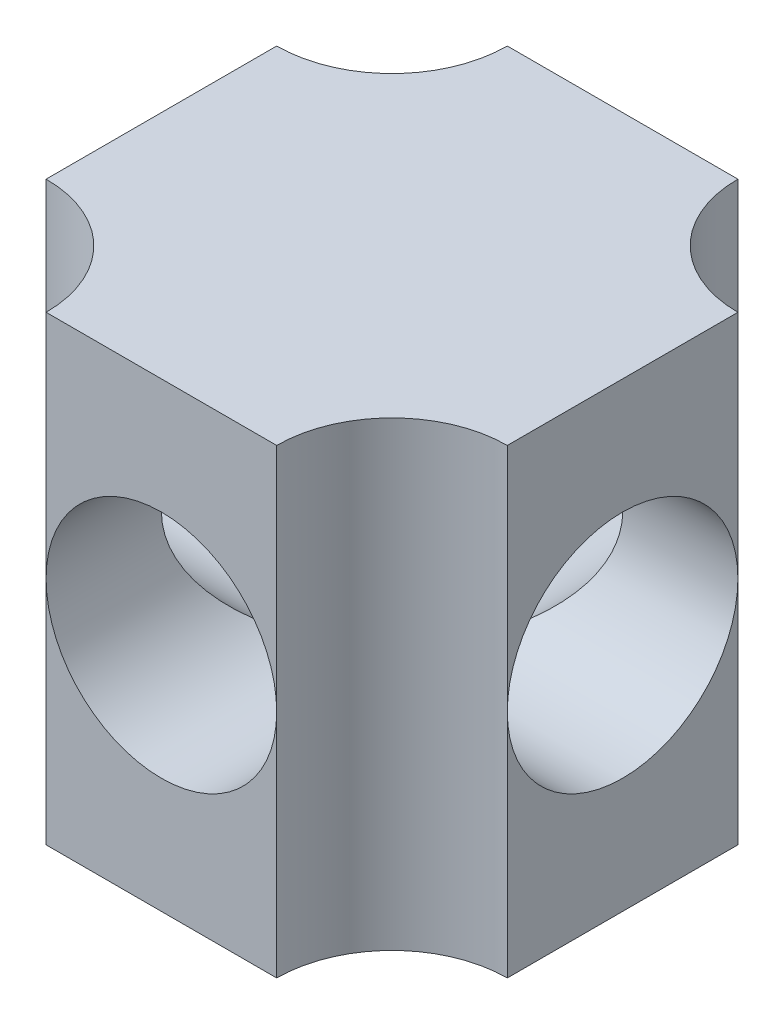
ISO-10303-21;
HEADER;
FILE_DESCRIPTION(('STEP AP214'),'2;1');
FILE_NAME('part.step','',(''),(''),'','','');
FILE_SCHEMA(('AUTOMOTIVE_DESIGN { 1 0 10303 214 1 1 1 1 }'));
ENDSEC;
DATA;
#1=APPLICATION_CONTEXT('core data for automotive mechanical design processes');
#2=APPLICATION_PROTOCOL_DEFINITION('international standard','automotive_design',2000,#1);
#3=PRODUCT_CONTEXT('',#1,'mechanical');
#4=PRODUCT('Part','Part','',(#3));
#5=PRODUCT_RELATED_PRODUCT_CATEGORY('part','',(#4));
#6=PRODUCT_DEFINITION_FORMATION('','',#4);
#7=PRODUCT_DEFINITION_CONTEXT('part definition',#1,'design');
#8=PRODUCT_DEFINITION('design','',#6,#7);
#9=PRODUCT_DEFINITION_SHAPE('','',#8);
#10=(LENGTH_UNIT() NAMED_UNIT(*) SI_UNIT(.MILLI.,.METRE.));
#11=(NAMED_UNIT(*) PLANE_ANGLE_UNIT() SI_UNIT($,.RADIAN.));
#12=(NAMED_UNIT(*) SI_UNIT($,.STERADIAN.) SOLID_ANGLE_UNIT());
#13=UNCERTAINTY_MEASURE_WITH_UNIT(LENGTH_MEASURE(1.E-05),#10,'distance_accuracy_value','');
#14=(GEOMETRIC_REPRESENTATION_CONTEXT(3) GLOBAL_UNCERTAINTY_ASSIGNED_CONTEXT((#13)) GLOBAL_UNIT_ASSIGNED_CONTEXT((#10,
#11,#12)) REPRESENTATION_CONTEXT('',''));
#15=CARTESIAN_POINT('',(0.,0.,0.));
#16=DIRECTION('',(0.,0.,1.));
#17=DIRECTION('',(1.,0.,0.));
#18=AXIS2_PLACEMENT_3D('',#15,#16,#17);
#19=CARTESIAN_POINT('',(50.,100.,50.));
#20=DIRECTION('',(-1.,0.,0.));
#21=DIRECTION('',(0.,0.,1.));
#22=AXIS2_PLACEMENT_3D('',#19,#20,#21);
#23=PLANE('',#22);
#24=DIRECTION('',(0.,0.,-1.));
#25=VECTOR('',#24,1.);
#26=CARTESIAN_POINT('',(50.,0.,50.));
#27=LINE('',#26,#25);
#28=CARTESIAN_POINT('',(50.,0.,25.));
#29=VERTEX_POINT('',#28);
#30=CARTESIAN_POINT('',(50.,0.,-25.));
#31=VERTEX_POINT('',#30);
#32=EDGE_CURVE('E150',#29,#31,#27,.T.);
#33=ORIENTED_EDGE('',*,*,#32,.T.);
#34=DIRECTION('',(0.,1.,0.));
#35=VECTOR('',#34,1.);
#36=CARTESIAN_POINT('',(50.,0.,-25.));
#37=LINE('',#36,#35);
#38=CARTESIAN_POINT('',(50.,50.,-25.));
#39=VERTEX_POINT('',#38);
#40=EDGE_CURVE('E299',#31,#39,#37,.T.);
#41=ORIENTED_EDGE('',*,*,#40,.T.);
#42=CARTESIAN_POINT('',(50.,50.,0.));
#43=DIRECTION('',(-1.,0.,0.));
#44=DIRECTION('',(0.,0.,1.));
#45=AXIS2_PLACEMENT_3D('',#42,#43,#44);
#46=CIRCLE('',#45,25.);
#47=CARTESIAN_POINT('',(50.,50.,25.));
#48=VERTEX_POINT('',#47);
#49=EDGE_CURVE('E152',#39,#48,#46,.T.);
#50=ORIENTED_EDGE('',*,*,#49,.T.);
#51=DIRECTION('',(0.,1.,0.));
#52=VECTOR('',#51,1.);
#53=CARTESIAN_POINT('',(50.,0.,25.));
#54=LINE('',#53,#52);
#55=EDGE_CURVE('E136',#48,#29,#54,.F.);
#56=ORIENTED_EDGE('',*,*,#55,.T.);
#57=EDGE_LOOP('',(#33,#41,#50,#56));
#58=FACE_BOUND('',#57,.T.);
#59=ADVANCED_FACE('F41',(#58),#23,.F.);
#60=CARTESIAN_POINT('',(-50.,100.,-50.));
#61=DIRECTION('',(0.,0.,1.));
#62=DIRECTION('',(1.,0.,0.));
#63=AXIS2_PLACEMENT_3D('',#60,#61,#62);
#64=PLANE('',#63);
#65=DIRECTION('',(-1.,0.,0.));
#66=VECTOR('',#65,1.);
#67=CARTESIAN_POINT('',(-50.,100.,-50.));
#68=LINE('',#67,#66);
#69=CARTESIAN_POINT('',(25.,100.,-50.));
#70=VERTEX_POINT('',#69);
#71=CARTESIAN_POINT('',(-25.,100.,-50.));
#72=VERTEX_POINT('',#71);
#73=EDGE_CURVE('E262',#70,#72,#68,.T.);
#74=ORIENTED_EDGE('',*,*,#73,.F.);
#75=DIRECTION('',(0.,1.,0.));
#76=VECTOR('',#75,1.);
#77=CARTESIAN_POINT('',(25.,0.,-50.));
#78=LINE('',#77,#76);
#79=CARTESIAN_POINT('',(25.,50.,-50.));
#80=VERTEX_POINT('',#79);
#81=EDGE_CURVE('E296',#70,#80,#78,.F.);
#82=ORIENTED_EDGE('',*,*,#81,.T.);
#83=CARTESIAN_POINT('',(0.,50.,-50.));
#84=DIRECTION('',(0.,0.,1.));
#85=DIRECTION('',(1.,0.,0.));
#86=AXIS2_PLACEMENT_3D('',#83,#84,#85);
#87=CIRCLE('',#86,25.);
#88=CARTESIAN_POINT('',(-25.,50.,-50.));
#89=VERTEX_POINT('',#88);
#90=EDGE_CURVE('E169',#80,#89,#87,.T.);
#91=ORIENTED_EDGE('',*,*,#90,.T.);
#92=DIRECTION('',(0.,1.,0.));
#93=VECTOR('',#92,1.);
#94=CARTESIAN_POINT('',(-25.,0.,-50.));
#95=LINE('',#94,#93);
#96=EDGE_CURVE('E253',#89,#72,#95,.T.);
#97=ORIENTED_EDGE('',*,*,#96,.T.);
#98=EDGE_LOOP('',(#74,#82,#91,#97));
#99=FACE_BOUND('',#98,.T.);
#100=ADVANCED_FACE('F219',(#99),#64,.F.);
#101=CARTESIAN_POINT('',(-50.,100.,50.));
#102=DIRECTION('',(1.,0.,0.));
#103=DIRECTION('',(0.,0.,-1.));
#104=AXIS2_PLACEMENT_3D('',#101,#102,#103);
#105=PLANE('',#104);
#106=DIRECTION('',(0.,0.,1.));
#107=VECTOR('',#106,1.);
#108=CARTESIAN_POINT('',(-50.,0.,50.));
#109=LINE('',#108,#107);
#110=CARTESIAN_POINT('',(-50.,0.,-25.));
#111=VERTEX_POINT('',#110);
#112=CARTESIAN_POINT('',(-50.,0.,25.));
#113=VERTEX_POINT('',#112);
#114=EDGE_CURVE('E166',#111,#113,#109,.T.);
#115=ORIENTED_EDGE('',*,*,#114,.T.);
#116=DIRECTION('',(0.,1.,0.));
#117=VECTOR('',#116,1.);
#118=CARTESIAN_POINT('',(-50.,0.,25.));
#119=LINE('',#118,#117);
#120=CARTESIAN_POINT('',(-50.,50.,25.));
#121=VERTEX_POINT('',#120);
#122=EDGE_CURVE('E57',#113,#121,#119,.T.);
#123=ORIENTED_EDGE('',*,*,#122,.T.);
#124=CARTESIAN_POINT('',(-50.,50.,0.));
#125=DIRECTION('',(-1.,0.,0.));
#126=DIRECTION('',(0.,0.,1.));
#127=AXIS2_PLACEMENT_3D('',#124,#125,#126);
#128=CIRCLE('',#127,25.);
#129=CARTESIAN_POINT('',(-50.,50.,-25.));
#130=VERTEX_POINT('',#129);
#131=EDGE_CURVE('E250',#130,#121,#128,.T.);
#132=ORIENTED_EDGE('',*,*,#131,.F.);
#133=DIRECTION('',(0.,1.,0.));
#134=VECTOR('',#133,1.);
#135=CARTESIAN_POINT('',(-50.,0.,-25.));
#136=LINE('',#135,#134);
#137=EDGE_CURVE('E312',#130,#111,#136,.F.);
#138=ORIENTED_EDGE('',*,*,#137,.T.);
#139=EDGE_LOOP('',(#115,#123,#132,#138));
#140=FACE_BOUND('',#139,.T.);
#141=ADVANCED_FACE('F223',(#140),#105,.F.);
#142=CARTESIAN_POINT('',(-50.,100.,50.));
#143=DIRECTION('',(0.,0.,-1.));
#144=DIRECTION('',(-1.,0.,0.));
#145=AXIS2_PLACEMENT_3D('',#142,#143,#144);
#146=PLANE('',#145);
#147=DIRECTION('',(1.,0.,0.));
#148=VECTOR('',#147,1.);
#149=CARTESIAN_POINT('',(-50.,100.,50.));
#150=LINE('',#149,#148);
#151=CARTESIAN_POINT('',(-25.,100.,50.));
#152=VERTEX_POINT('',#151);
#153=CARTESIAN_POINT('',(25.,100.,50.));
#154=VERTEX_POINT('',#153);
#155=EDGE_CURVE('E172',#152,#154,#150,.T.);
#156=ORIENTED_EDGE('',*,*,#155,.F.);
#157=DIRECTION('',(0.,1.,0.));
#158=VECTOR('',#157,1.);
#159=CARTESIAN_POINT('',(-25.,0.,50.));
#160=LINE('',#159,#158);
#161=CARTESIAN_POINT('',(-25.,50.,50.));
#162=VERTEX_POINT('',#161);
#163=EDGE_CURVE('E281',#152,#162,#160,.F.);
#164=ORIENTED_EDGE('',*,*,#163,.T.);
#165=CARTESIAN_POINT('',(0.,50.,50.));
#166=DIRECTION('',(0.,0.,1.));
#167=DIRECTION('',(1.,0.,0.));
#168=AXIS2_PLACEMENT_3D('',#165,#166,#167);
#169=CIRCLE('',#168,25.);
#170=CARTESIAN_POINT('',(25.,50.,50.));
#171=VERTEX_POINT('',#170);
#172=EDGE_CURVE('E248',#171,#162,#169,.T.);
#173=ORIENTED_EDGE('',*,*,#172,.F.);
#174=DIRECTION('',(0.,1.,0.));
#175=VECTOR('',#174,1.);
#176=CARTESIAN_POINT('',(25.,0.,50.));
#177=LINE('',#176,#175);
#178=EDGE_CURVE('E283',#171,#154,#177,.T.);
#179=ORIENTED_EDGE('',*,*,#178,.T.);
#180=EDGE_LOOP('',(#156,#164,#173,#179));
#181=FACE_BOUND('',#180,.T.);
#182=ADVANCED_FACE('F234',(#181),#146,.F.);
#183=CARTESIAN_POINT('',(0.,50.,-50.));
#184=DIRECTION('',(0.,0.,1.));
#185=DIRECTION('',(1.,0.,0.));
#186=AXIS2_PLACEMENT_3D('',#183,#184,#185);
#187=CYLINDRICAL_SURFACE('',#186,25.);
#188=ORIENTED_EDGE('',*,*,#172,.T.);
#189=EDGE_CURVE('E243',#162,#171,#169,.T.);
#190=ORIENTED_EDGE('',*,*,#189,.T.);
#191=EDGE_LOOP('',(#188,#190));
#192=FACE_BOUND('',#191,.T.);
#193=CARTESIAN_POINT('',(0.,50.,0.));
#194=DIRECTION('',(0.707106781186548,0.,0.707106781186547));
#195=DIRECTION('',(-0.707106781186547,0.,0.707106781186547));
#196=AXIS2_PLACEMENT_3D('',#193,#194,#195);
#197=ELLIPSE('',#196,35.3553390593274,25.);
#198=CARTESIAN_POINT('',(0.,25.,0.));
#199=VERTEX_POINT('',#198);
#200=CARTESIAN_POINT('',(0.,75.,0.));
#201=VERTEX_POINT('',#200);
#202=EDGE_CURVE('E182',#199,#201,#197,.F.);
#203=ORIENTED_EDGE('',*,*,#202,.T.);
#204=CARTESIAN_POINT('',(0.,50.,0.));
#205=DIRECTION('',(-0.707106781186547,0.,0.707106781186547));
#206=DIRECTION('',(0.707106781186548,0.,0.707106781186547));
#207=AXIS2_PLACEMENT_3D('',#204,#205,#206);
#208=ELLIPSE('',#207,35.3553390593274,25.);
#209=EDGE_CURVE('E50',#201,#199,#208,.F.);
#210=ORIENTED_EDGE('',*,*,#209,.T.);
#211=EDGE_LOOP('',(#203,#210));
#212=FACE_BOUND('',#211,.T.);
#213=ADVANCED_FACE('F196',(#192,#212),#187,.F.);
#214=EDGE_CURVE('E238',#48,#39,#46,.T.);
#215=ORIENTED_EDGE('',*,*,#214,.T.);
#216=CARTESIAN_POINT('',(50.,100.,-25.));
#217=VERTEX_POINT('',#216);
#218=EDGE_CURVE('E240',#39,#217,#37,.T.);
#219=ORIENTED_EDGE('',*,*,#218,.T.);
#220=DIRECTION('',(0.,0.,-1.));
#221=VECTOR('',#220,1.);
#222=CARTESIAN_POINT('',(50.,100.,50.));
#223=LINE('',#222,#221);
#224=CARTESIAN_POINT('',(50.,100.,25.));
#225=VERTEX_POINT('',#224);
#226=EDGE_CURVE('E181',#225,#217,#223,.T.);
#227=ORIENTED_EDGE('',*,*,#226,.F.);
#228=EDGE_CURVE('E155',#225,#48,#54,.F.);
#229=ORIENTED_EDGE('',*,*,#228,.T.);
#230=EDGE_LOOP('',(#215,#219,#227,#229));
#231=FACE_BOUND('',#230,.T.);
#232=ADVANCED_FACE('F43',(#231),#23,.F.);
#233=EDGE_CURVE('E162',#89,#80,#87,.T.);
#234=ORIENTED_EDGE('',*,*,#233,.T.);
#235=CARTESIAN_POINT('',(25.,0.,-50.));
#236=VERTEX_POINT('',#235);
#237=EDGE_CURVE('E292',#80,#236,#78,.F.);
#238=ORIENTED_EDGE('',*,*,#237,.T.);
#239=DIRECTION('',(-1.,0.,0.));
#240=VECTOR('',#239,1.);
#241=CARTESIAN_POINT('',(-50.,0.,-50.));
#242=LINE('',#241,#240);
#243=CARTESIAN_POINT('',(-25.,0.,-50.));
#244=VERTEX_POINT('',#243);
#245=EDGE_CURVE('E161',#236,#244,#242,.T.);
#246=ORIENTED_EDGE('',*,*,#245,.T.);
#247=EDGE_CURVE('E329',#244,#89,#95,.T.);
#248=ORIENTED_EDGE('',*,*,#247,.T.);
#249=EDGE_LOOP('',(#234,#238,#246,#248));
#250=FACE_BOUND('',#249,.T.);
#251=ADVANCED_FACE('F225',(#250),#64,.F.);
#252=EDGE_CURVE('E256',#121,#130,#128,.T.);
#253=ORIENTED_EDGE('',*,*,#252,.F.);
#254=CARTESIAN_POINT('',(-50.,100.,25.));
#255=VERTEX_POINT('',#254);
#256=EDGE_CURVE('E304',#121,#255,#119,.T.);
#257=ORIENTED_EDGE('',*,*,#256,.T.);
#258=DIRECTION('',(0.,0.,1.));
#259=VECTOR('',#258,1.);
#260=CARTESIAN_POINT('',(-50.,100.,50.));
#261=LINE('',#260,#259);
#262=CARTESIAN_POINT('',(-50.,100.,-25.));
#263=VERTEX_POINT('',#262);
#264=EDGE_CURVE('E264',#263,#255,#261,.T.);
#265=ORIENTED_EDGE('',*,*,#264,.F.);
#266=EDGE_CURVE('E318',#263,#130,#136,.F.);
#267=ORIENTED_EDGE('',*,*,#266,.T.);
#268=EDGE_LOOP('',(#253,#257,#265,#267));
#269=FACE_BOUND('',#268,.T.);
#270=ADVANCED_FACE('F232',(#269),#105,.F.);
#271=ORIENTED_EDGE('',*,*,#189,.F.);
#272=CARTESIAN_POINT('',(-25.,0.,50.));
#273=VERTEX_POINT('',#272);
#274=EDGE_CURVE('E300',#162,#273,#160,.F.);
#275=ORIENTED_EDGE('',*,*,#274,.T.);
#276=DIRECTION('',(1.,0.,0.));
#277=VECTOR('',#276,1.);
#278=CARTESIAN_POINT('',(-50.,0.,50.));
#279=LINE('',#278,#277);
#280=CARTESIAN_POINT('',(25.,0.,50.));
#281=VERTEX_POINT('',#280);
#282=EDGE_CURVE('E178',#273,#281,#279,.T.);
#283=ORIENTED_EDGE('',*,*,#282,.T.);
#284=EDGE_CURVE('E65',#281,#171,#177,.T.);
#285=ORIENTED_EDGE('',*,*,#284,.T.);
#286=EDGE_LOOP('',(#271,#275,#283,#285));
#287=FACE_BOUND('',#286,.T.);
#288=ADVANCED_FACE('F355',(#287),#146,.F.);
#289=CARTESIAN_POINT('',(0.,100.,0.));
#290=DIRECTION('',(0.,-1.,0.));
#291=DIRECTION('',(0.,0.,-1.));
#292=AXIS2_PLACEMENT_3D('',#289,#290,#291);
#293=PLANE('',#292);
#294=ORIENTED_EDGE('',*,*,#264,.T.);
#295=CARTESIAN_POINT('',(-50.,100.,50.));
#296=DIRECTION('',(0.,1.,0.));
#297=DIRECTION('',(0.,0.,1.));
#298=AXIS2_PLACEMENT_3D('',#295,#296,#297);
#299=CIRCLE('',#298,25.);
#300=EDGE_CURVE('E276',#152,#255,#299,.T.);
#301=ORIENTED_EDGE('',*,*,#300,.F.);
#302=ORIENTED_EDGE('',*,*,#155,.T.);
#303=CARTESIAN_POINT('',(50.,100.,50.));
#304=DIRECTION('',(0.,1.,0.));
#305=DIRECTION('',(0.,0.,1.));
#306=AXIS2_PLACEMENT_3D('',#303,#304,#305);
#307=CIRCLE('',#306,25.);
#308=EDGE_CURVE('E144',#225,#154,#307,.T.);
#309=ORIENTED_EDGE('',*,*,#308,.F.);
#310=ORIENTED_EDGE('',*,*,#226,.T.);
#311=CARTESIAN_POINT('',(50.,100.,-50.));
#312=DIRECTION('',(0.,1.,0.));
#313=DIRECTION('',(0.,0.,1.));
#314=AXIS2_PLACEMENT_3D('',#311,#312,#313);
#315=CIRCLE('',#314,25.);
#316=EDGE_CURVE('E143',#70,#217,#315,.T.);
#317=ORIENTED_EDGE('',*,*,#316,.F.);
#318=ORIENTED_EDGE('',*,*,#73,.T.);
#319=CARTESIAN_POINT('',(-50.,100.,-50.));
#320=DIRECTION('',(0.,1.,0.));
#321=DIRECTION('',(0.,0.,1.));
#322=AXIS2_PLACEMENT_3D('',#319,#320,#321);
#323=CIRCLE('',#322,25.);
#324=EDGE_CURVE('E313',#263,#72,#323,.T.);
#325=ORIENTED_EDGE('',*,*,#324,.F.);
#326=EDGE_LOOP('',(#294,#301,#302,#309,#310,#317,#318,#325));
#327=FACE_BOUND('',#326,.T.);
#328=ADVANCED_FACE('F275',(#327),#293,.F.);
#329=CARTESIAN_POINT('',(0.,0.,0.));
#330=DIRECTION('',(0.,-1.,0.));
#331=DIRECTION('',(0.,0.,-1.));
#332=AXIS2_PLACEMENT_3D('',#329,#330,#331);
#333=PLANE('',#332);
#334=CARTESIAN_POINT('',(-50.,0.,50.));
#335=DIRECTION('',(0.,1.,0.));
#336=DIRECTION('',(0.,0.,1.));
#337=AXIS2_PLACEMENT_3D('',#334,#335,#336);
#338=CIRCLE('',#337,25.);
#339=EDGE_CURVE('E285',#273,#113,#338,.T.);
#340=ORIENTED_EDGE('',*,*,#339,.T.);
#341=ORIENTED_EDGE('',*,*,#114,.F.);
#342=CARTESIAN_POINT('',(-50.,0.,-50.));
#343=DIRECTION('',(0.,1.,0.));
#344=DIRECTION('',(0.,0.,1.));
#345=AXIS2_PLACEMENT_3D('',#342,#343,#344);
#346=CIRCLE('',#345,25.);
#347=EDGE_CURVE('E308',#111,#244,#346,.T.);
#348=ORIENTED_EDGE('',*,*,#347,.T.);
#349=ORIENTED_EDGE('',*,*,#245,.F.);
#350=CARTESIAN_POINT('',(50.,0.,-50.));
#351=DIRECTION('',(0.,-1.,0.));
#352=DIRECTION('',(0.,0.,-1.));
#353=AXIS2_PLACEMENT_3D('',#350,#351,#352);
#354=CIRCLE('',#353,25.);
#355=EDGE_CURVE('E11',#31,#236,#354,.T.);
#356=ORIENTED_EDGE('',*,*,#355,.F.);
#357=ORIENTED_EDGE('',*,*,#32,.F.);
#358=CARTESIAN_POINT('',(50.,0.,50.));
#359=DIRECTION('',(0.,1.,0.));
#360=DIRECTION('',(0.,0.,1.));
#361=AXIS2_PLACEMENT_3D('',#358,#359,#360);
#362=CIRCLE('',#361,25.);
#363=EDGE_CURVE('E133',#29,#281,#362,.T.);
#364=ORIENTED_EDGE('',*,*,#363,.T.);
#365=ORIENTED_EDGE('',*,*,#282,.F.);
#366=EDGE_LOOP('',(#340,#341,#348,#349,#356,#357,#364,#365));
#367=FACE_BOUND('',#366,.T.);
#368=ADVANCED_FACE('F158',(#367),#333,.T.);
#369=CARTESIAN_POINT('',(0.,50.,0.));
#370=DIRECTION('',(0.707106781186548,0.,0.707106781186547));
#371=DIRECTION('',(-0.707106781186547,0.,0.707106781186547));
#372=AXIS2_PLACEMENT_3D('',#369,#370,#371);
#373=ELLIPSE('',#372,35.3553390593274,25.);
#374=EDGE_CURVE('E185',#199,#201,#373,.T.);
#375=ORIENTED_EDGE('',*,*,#374,.T.);
#376=CARTESIAN_POINT('',(0.,50.,0.));
#377=DIRECTION('',(-0.707106781186547,0.,0.707106781186547));
#378=DIRECTION('',(0.707106781186548,0.,0.707106781186547));
#379=AXIS2_PLACEMENT_3D('',#376,#377,#378);
#380=ELLIPSE('',#379,35.3553390593274,25.);
#381=EDGE_CURVE('E189',#201,#199,#380,.T.);
#382=ORIENTED_EDGE('',*,*,#381,.T.);
#383=EDGE_LOOP('',(#375,#382));
#384=FACE_BOUND('',#383,.T.);
#385=ORIENTED_EDGE('',*,*,#233,.F.);
#386=ORIENTED_EDGE('',*,*,#90,.F.);
#387=EDGE_LOOP('',(#385,#386));
#388=FACE_BOUND('',#387,.T.);
#389=ADVANCED_FACE('F201',(#384,#388),#187,.F.);
#390=CARTESIAN_POINT('',(50.,50.,0.));
#391=DIRECTION('',(-1.,0.,0.));
#392=DIRECTION('',(0.,0.,1.));
#393=AXIS2_PLACEMENT_3D('',#390,#391,#392);
#394=CYLINDRICAL_SURFACE('',#393,25.);
#395=ORIENTED_EDGE('',*,*,#131,.T.);
#396=ORIENTED_EDGE('',*,*,#252,.T.);
#397=EDGE_LOOP('',(#395,#396));
#398=FACE_BOUND('',#397,.T.);
#399=ORIENTED_EDGE('',*,*,#202,.F.);
#400=ORIENTED_EDGE('',*,*,#381,.F.);
#401=EDGE_LOOP('',(#399,#400));
#402=FACE_BOUND('',#401,.T.);
#403=ADVANCED_FACE('F204',(#398,#402),#394,.F.);
#404=ORIENTED_EDGE('',*,*,#214,.F.);
#405=ORIENTED_EDGE('',*,*,#49,.F.);
#406=EDGE_LOOP('',(#404,#405));
#407=FACE_BOUND('',#406,.T.);
#408=ORIENTED_EDGE('',*,*,#374,.F.);
#409=ORIENTED_EDGE('',*,*,#209,.F.);
#410=EDGE_LOOP('',(#408,#409));
#411=FACE_BOUND('',#410,.T.);
#412=ADVANCED_FACE('F206',(#407,#411),#394,.F.);
#413=CARTESIAN_POINT('',(-50.,0.,-50.));
#414=DIRECTION('',(0.,1.,0.));
#415=DIRECTION('',(0.,0.,1.));
#416=AXIS2_PLACEMENT_3D('',#413,#414,#415);
#417=CYLINDRICAL_SURFACE('',#416,25.);
#418=ORIENTED_EDGE('',*,*,#347,.F.);
#419=ORIENTED_EDGE('',*,*,#137,.F.);
#420=ORIENTED_EDGE('',*,*,#266,.F.);
#421=ORIENTED_EDGE('',*,*,#324,.T.);
#422=ORIENTED_EDGE('',*,*,#96,.F.);
#423=ORIENTED_EDGE('',*,*,#247,.F.);
#424=EDGE_LOOP('',(#418,#419,#420,#421,#422,#423));
#425=FACE_BOUND('',#424,.T.);
#426=ADVANCED_FACE('F213',(#425),#417,.F.);
#427=CARTESIAN_POINT('',(50.,0.,50.));
#428=DIRECTION('',(0.,1.,0.));
#429=DIRECTION('',(0.,0.,1.));
#430=AXIS2_PLACEMENT_3D('',#427,#428,#429);
#431=CYLINDRICAL_SURFACE('',#430,25.);
#432=ORIENTED_EDGE('',*,*,#308,.T.);
#433=ORIENTED_EDGE('',*,*,#178,.F.);
#434=ORIENTED_EDGE('',*,*,#284,.F.);
#435=ORIENTED_EDGE('',*,*,#363,.F.);
#436=ORIENTED_EDGE('',*,*,#55,.F.);
#437=ORIENTED_EDGE('',*,*,#228,.F.);
#438=EDGE_LOOP('',(#432,#433,#434,#435,#436,#437));
#439=FACE_BOUND('',#438,.T.);
#440=ADVANCED_FACE('F135',(#439),#431,.F.);
#441=CARTESIAN_POINT('',(50.,0.,-50.));
#442=DIRECTION('',(0.,1.,0.));
#443=DIRECTION('',(0.,0.,1.));
#444=AXIS2_PLACEMENT_3D('',#441,#442,#443);
#445=CYLINDRICAL_SURFACE('',#444,25.);
#446=ORIENTED_EDGE('',*,*,#355,.T.);
#447=ORIENTED_EDGE('',*,*,#237,.F.);
#448=ORIENTED_EDGE('',*,*,#81,.F.);
#449=ORIENTED_EDGE('',*,*,#316,.T.);
#450=ORIENTED_EDGE('',*,*,#218,.F.);
#451=ORIENTED_EDGE('',*,*,#40,.F.);
#452=EDGE_LOOP('',(#446,#447,#448,#449,#450,#451));
#453=FACE_BOUND('',#452,.T.);
#454=ADVANCED_FACE('F348',(#453),#445,.F.);
#455=CARTESIAN_POINT('',(-50.,0.,50.));
#456=DIRECTION('',(0.,1.,0.));
#457=DIRECTION('',(0.,0.,1.));
#458=AXIS2_PLACEMENT_3D('',#455,#456,#457);
#459=CYLINDRICAL_SURFACE('',#458,25.);
#460=ORIENTED_EDGE('',*,*,#339,.F.);
#461=ORIENTED_EDGE('',*,*,#274,.F.);
#462=ORIENTED_EDGE('',*,*,#163,.F.);
#463=ORIENTED_EDGE('',*,*,#300,.T.);
#464=ORIENTED_EDGE('',*,*,#256,.F.);
#465=ORIENTED_EDGE('',*,*,#122,.F.);
#466=EDGE_LOOP('',(#460,#461,#462,#463,#464,#465));
#467=FACE_BOUND('',#466,.T.);
#468=ADVANCED_FACE('F353',(#467),#459,.F.);
#469=CLOSED_SHELL('',(#59,#100,#141,#182,#213,#232,#251,#270,#288,#328,#368,#389,#403,#412,#426,
#440,#454,#468));
#470=MANIFOLD_SOLID_BREP('B2',#469);
#471=ADVANCED_BREP_SHAPE_REPRESENTATION('',(#18,#470),#14);
#472=SHAPE_DEFINITION_REPRESENTATION(#9,#471);
ENDSEC;
END-ISO-10303-21;
